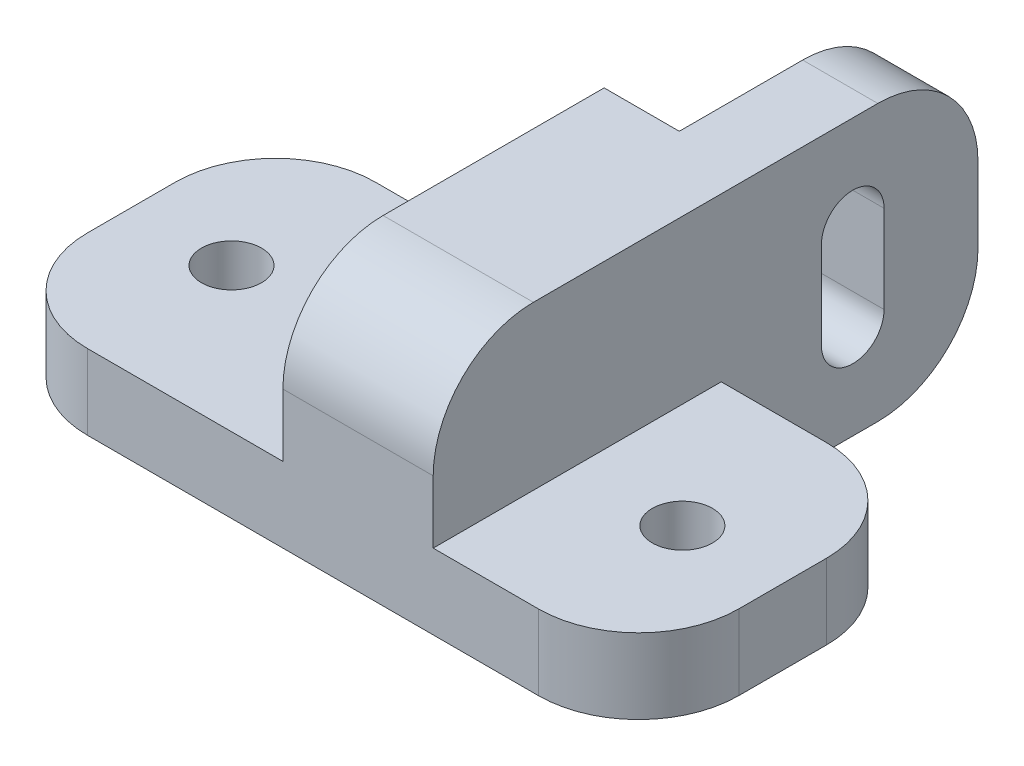
ISO-10303-21;
HEADER;
FILE_DESCRIPTION(('STEP AP214'),'2;1');
FILE_NAME('part.step','',(''),(''),'','','');
FILE_SCHEMA(('AUTOMOTIVE_DESIGN { 1 0 10303 214 1 1 1 1 }'));
ENDSEC;
DATA;
#1=APPLICATION_CONTEXT('core data for automotive mechanical design processes');
#2=APPLICATION_PROTOCOL_DEFINITION('international standard','automotive_design',2000,#1);
#3=PRODUCT_CONTEXT('',#1,'mechanical');
#4=PRODUCT('Part','Part','',(#3));
#5=PRODUCT_RELATED_PRODUCT_CATEGORY('part','',(#4));
#6=PRODUCT_DEFINITION_FORMATION('','',#4);
#7=PRODUCT_DEFINITION_CONTEXT('part definition',#1,'design');
#8=PRODUCT_DEFINITION('design','',#6,#7);
#9=PRODUCT_DEFINITION_SHAPE('','',#8);
#10=(LENGTH_UNIT() NAMED_UNIT(*) SI_UNIT(.MILLI.,.METRE.));
#11=(NAMED_UNIT(*) PLANE_ANGLE_UNIT() SI_UNIT($,.RADIAN.));
#12=(NAMED_UNIT(*) SI_UNIT($,.STERADIAN.) SOLID_ANGLE_UNIT());
#13=UNCERTAINTY_MEASURE_WITH_UNIT(LENGTH_MEASURE(1.E-05),#10,'distance_accuracy_value','');
#14=(GEOMETRIC_REPRESENTATION_CONTEXT(3) GLOBAL_UNCERTAINTY_ASSIGNED_CONTEXT((#13)) GLOBAL_UNIT_ASSIGNED_CONTEXT((#10,
#11,#12)) REPRESENTATION_CONTEXT('',''));
#15=CARTESIAN_POINT('',(0.,0.,0.));
#16=DIRECTION('',(0.,0.,1.));
#17=DIRECTION('',(1.,0.,0.));
#18=AXIS2_PLACEMENT_3D('',#15,#16,#17);
#19=CARTESIAN_POINT('',(1.8,0.,0.));
#20=DIRECTION('',(1.,0.,0.));
#21=DIRECTION('',(0.,0.,-1.));
#22=AXIS2_PLACEMENT_3D('',#19,#20,#21);
#23=PLANE('',#22);
#24=DIRECTION('',(0.,-1.,0.));
#25=VECTOR('',#24,1.);
#26=CARTESIAN_POINT('',(1.8,0.,-9.75));
#27=LINE('',#26,#25);
#28=CARTESIAN_POINT('',(1.8,5.75,-9.75));
#29=VERTEX_POINT('',#28);
#30=CARTESIAN_POINT('',(1.8,2.25,-9.75));
#31=VERTEX_POINT('',#30);
#32=EDGE_CURVE('E233',#29,#31,#27,.T.);
#33=ORIENTED_EDGE('',*,*,#32,.T.);
#34=CARTESIAN_POINT('',(1.8,2.25,-11.));
#35=DIRECTION('',(1.,0.,0.));
#36=DIRECTION('',(0.,0.,-1.));
#37=AXIS2_PLACEMENT_3D('',#34,#35,#36);
#38=CIRCLE('',#37,1.25);
#39=CARTESIAN_POINT('',(1.8,2.25,-12.25));
#40=VERTEX_POINT('',#39);
#41=EDGE_CURVE('E236',#31,#40,#38,.T.);
#42=ORIENTED_EDGE('',*,*,#41,.T.);
#43=DIRECTION('',(0.,1.,0.));
#44=VECTOR('',#43,1.);
#45=CARTESIAN_POINT('',(1.8,0.,-12.25));
#46=LINE('',#45,#44);
#47=CARTESIAN_POINT('',(1.8,5.75,-12.25));
#48=VERTEX_POINT('',#47);
#49=EDGE_CURVE('E228',#40,#48,#46,.T.);
#50=ORIENTED_EDGE('',*,*,#49,.T.);
#51=CARTESIAN_POINT('',(1.8,5.75,-11.));
#52=DIRECTION('',(1.,0.,0.));
#53=DIRECTION('',(0.,0.,-1.));
#54=AXIS2_PLACEMENT_3D('',#51,#52,#53);
#55=CIRCLE('',#54,1.25);
#56=EDGE_CURVE('E204',#48,#29,#55,.T.);
#57=ORIENTED_EDGE('',*,*,#56,.T.);
#58=EDGE_LOOP('',(#33,#42,#50,#57));
#59=FACE_BOUND('',#58,.T.);
#60=DIRECTION('',(0.,1.,0.));
#61=VECTOR('',#60,1.);
#62=CARTESIAN_POINT('',(1.8,3.,-16.));
#63=LINE('',#62,#61);
#64=CARTESIAN_POINT('',(1.8,2.5,-16.));
#65=VERTEX_POINT('',#64);
#66=CARTESIAN_POINT('',(1.8,5.5,-16.));
#67=VERTEX_POINT('',#66);
#68=EDGE_CURVE('E287',#65,#67,#63,.T.);
#69=ORIENTED_EDGE('',*,*,#68,.F.);
#70=CARTESIAN_POINT('',(1.8,2.5,-12.));
#71=DIRECTION('',(1.,0.,0.));
#72=DIRECTION('',(0.,0.,-1.));
#73=AXIS2_PLACEMENT_3D('',#70,#71,#72);
#74=CIRCLE('',#73,4.);
#75=CARTESIAN_POINT('',(1.8,-1.5,-12.));
#76=VERTEX_POINT('',#75);
#77=EDGE_CURVE('E372',#65,#76,#74,.F.);
#78=ORIENTED_EDGE('',*,*,#77,.T.);
#79=DIRECTION('',(0.,0.,-1.));
#80=VECTOR('',#79,1.);
#81=CARTESIAN_POINT('',(1.8,-1.5,-5.75));
#82=LINE('',#81,#80);
#83=CARTESIAN_POINT('',(1.8,-1.5,-7.07500000000134));
#84=VERTEX_POINT('',#83);
#85=EDGE_CURVE('E268',#84,#76,#82,.T.);
#86=ORIENTED_EDGE('',*,*,#85,.F.);
#87=DIRECTION('',(0.,-1.,0.));
#88=VECTOR('',#87,1.);
#89=CARTESIAN_POINT('',(1.8,9.5,-7.07500000000134));
#90=LINE('',#89,#88);
#91=CARTESIAN_POINT('',(1.8,9.5,-7.07500000000134));
#92=VERTEX_POINT('',#91);
#93=EDGE_CURVE('E239',#92,#84,#90,.T.);
#94=ORIENTED_EDGE('',*,*,#93,.F.);
#95=DIRECTION('',(0.,0.,1.));
#96=VECTOR('',#95,1.);
#97=CARTESIAN_POINT('',(1.8,9.5,0.));
#98=LINE('',#97,#96);
#99=CARTESIAN_POINT('',(1.8,9.5,-12.));
#100=VERTEX_POINT('',#99);
#101=EDGE_CURVE('E273',#100,#92,#98,.T.);
#102=ORIENTED_EDGE('',*,*,#101,.F.);
#103=CARTESIAN_POINT('',(1.8,5.5,-12.));
#104=DIRECTION('',(1.,0.,0.));
#105=DIRECTION('',(0.,0.,-1.));
#106=AXIS2_PLACEMENT_3D('',#103,#104,#105);
#107=CIRCLE('',#106,4.);
#108=EDGE_CURVE('E370',#100,#67,#107,.F.);
#109=ORIENTED_EDGE('',*,*,#108,.T.);
#110=EDGE_LOOP('',(#69,#78,#86,#94,#102,#109));
#111=FACE_BOUND('',#110,.T.);
#112=ADVANCED_FACE('F32',(#59,#111),#23,.F.);
#113=CARTESIAN_POINT('',(-13.,3.,-5.75));
#114=DIRECTION('',(0.,0.,1.));
#115=DIRECTION('',(1.,0.,0.));
#116=AXIS2_PLACEMENT_3D('',#113,#114,#115);
#117=PLANE('',#116);
#118=DIRECTION('',(-1.,0.,0.));
#119=VECTOR('',#118,1.);
#120=CARTESIAN_POINT('',(-13.,3.,-5.75));
#121=LINE('',#120,#119);
#122=CARTESIAN_POINT('',(-1.2,3.,-5.75));
#123=VERTEX_POINT('',#122);
#124=CARTESIAN_POINT('',(-9.,3.,-5.75));
#125=VERTEX_POINT('',#124);
#126=EDGE_CURVE('E296',#123,#125,#121,.T.);
#127=ORIENTED_EDGE('',*,*,#126,.F.);
#128=DIRECTION('',(0.,1.,0.));
#129=VECTOR('',#128,1.);
#130=CARTESIAN_POINT('',(-1.2,-1.5,-5.75));
#131=LINE('',#130,#129);
#132=CARTESIAN_POINT('',(-1.2,0.,-5.75));
#133=VERTEX_POINT('',#132);
#134=EDGE_CURVE('E256',#133,#123,#131,.T.);
#135=ORIENTED_EDGE('',*,*,#134,.F.);
#136=DIRECTION('',(-1.,0.,0.));
#137=VECTOR('',#136,1.);
#138=CARTESIAN_POINT('',(-13.,0.,-5.75));
#139=LINE('',#138,#137);
#140=CARTESIAN_POINT('',(-9.,0.,-5.75));
#141=VERTEX_POINT('',#140);
#142=EDGE_CURVE('E310',#133,#141,#139,.T.);
#143=ORIENTED_EDGE('',*,*,#142,.T.);
#144=DIRECTION('',(0.,-1.,0.));
#145=VECTOR('',#144,1.);
#146=CARTESIAN_POINT('',(-8.99999999999999,3.,-5.75));
#147=LINE('',#146,#145);
#148=EDGE_CURVE('E350',#141,#125,#147,.F.);
#149=ORIENTED_EDGE('',*,*,#148,.T.);
#150=EDGE_LOOP('',(#127,#135,#143,#149));
#151=FACE_BOUND('',#150,.T.);
#152=ADVANCED_FACE('F409',(#151),#117,.F.);
#153=CARTESIAN_POINT('',(0.,3.,0.));
#154=DIRECTION('',(0.,-1.,0.));
#155=DIRECTION('',(0.,0.,-1.));
#156=AXIS2_PLACEMENT_3D('',#153,#154,#155);
#157=PLANE('',#156);
#158=CARTESIAN_POINT('',(-9.000145119,3.,0.001069025));
#159=DIRECTION('',(0.,-1.,0.));
#160=DIRECTION('',(0.,0.,-1.));
#161=AXIS2_PLACEMENT_3D('',#158,#159,#160);
#162=CIRCLE('',#161,1.2);
#163=CARTESIAN_POINT('',(-9.000145119,3.,-1.198930975));
#164=VERTEX_POINT('',#163);
#165=EDGE_CURVE('E518',#164,#164,#162,.T.);
#166=ORIENTED_EDGE('',*,*,#165,.T.);
#167=EDGE_LOOP('',(#166));
#168=FACE_BOUND('',#167,.T.);
#169=DIRECTION('',(1.,0.,0.));
#170=VECTOR('',#169,1.);
#171=CARTESIAN_POINT('',(-13.,3.,5.75));
#172=LINE('',#171,#170);
#173=CARTESIAN_POINT('',(-9.,3.,5.75));
#174=VERTEX_POINT('',#173);
#175=CARTESIAN_POINT('',(-1.2,3.,5.75));
#176=VERTEX_POINT('',#175);
#177=EDGE_CURVE('E305',#174,#176,#172,.T.);
#178=ORIENTED_EDGE('',*,*,#177,.T.);
#179=DIRECTION('',(0.,0.,1.));
#180=VECTOR('',#179,1.);
#181=CARTESIAN_POINT('',(-1.2,3.,-5.75));
#182=LINE('',#181,#180);
#183=EDGE_CURVE('E240',#123,#176,#182,.T.);
#184=ORIENTED_EDGE('',*,*,#183,.F.);
#185=ORIENTED_EDGE('',*,*,#126,.T.);
#186=CARTESIAN_POINT('',(-8.99999999999999,3.,-1.75));
#187=DIRECTION('',(0.,-1.,0.));
#188=DIRECTION('',(0.,0.,-1.));
#189=AXIS2_PLACEMENT_3D('',#186,#187,#188);
#190=CIRCLE('',#189,4.);
#191=CARTESIAN_POINT('',(-13.,3.,-1.75));
#192=VERTEX_POINT('',#191);
#193=EDGE_CURVE('E343',#125,#192,#190,.F.);
#194=ORIENTED_EDGE('',*,*,#193,.T.);
#195=DIRECTION('',(0.,0.,1.));
#196=VECTOR('',#195,1.);
#197=CARTESIAN_POINT('',(-13.,3.,5.75));
#198=LINE('',#197,#196);
#199=CARTESIAN_POINT('',(-13.,3.,1.75));
#200=VERTEX_POINT('',#199);
#201=EDGE_CURVE('E301',#192,#200,#198,.T.);
#202=ORIENTED_EDGE('',*,*,#201,.T.);
#203=CARTESIAN_POINT('',(-8.99999999999999,3.,1.75));
#204=DIRECTION('',(0.,-1.,0.));
#205=DIRECTION('',(0.,0.,-1.));
#206=AXIS2_PLACEMENT_3D('',#203,#204,#205);
#207=CIRCLE('',#206,4.);
#208=EDGE_CURVE('E345',#200,#174,#207,.F.);
#209=ORIENTED_EDGE('',*,*,#208,.T.);
#210=EDGE_LOOP('',(#178,#184,#185,#194,#202,#209));
#211=FACE_BOUND('',#210,.T.);
#212=ADVANCED_FACE('F415',(#168,#211),#157,.F.);
#213=CARTESIAN_POINT('',(13.,3.,5.75));
#214=DIRECTION('',(-1.,0.,0.));
#215=DIRECTION('',(0.,0.,1.));
#216=AXIS2_PLACEMENT_3D('',#213,#214,#215);
#217=PLANE('',#216);
#218=DIRECTION('',(0.,0.,-1.));
#219=VECTOR('',#218,1.);
#220=CARTESIAN_POINT('',(13.,0.,5.75));
#221=LINE('',#220,#219);
#222=CARTESIAN_POINT('',(13.,0.,1.75));
#223=VERTEX_POINT('',#222);
#224=CARTESIAN_POINT('',(13.,0.,-1.75));
#225=VERTEX_POINT('',#224);
#226=EDGE_CURVE('E292',#223,#225,#221,.T.);
#227=ORIENTED_EDGE('',*,*,#226,.T.);
#228=DIRECTION('',(0.,-1.,0.));
#229=VECTOR('',#228,1.);
#230=CARTESIAN_POINT('',(13.,3.,-1.75));
#231=LINE('',#230,#229);
#232=CARTESIAN_POINT('',(13.,3.,-1.75));
#233=VERTEX_POINT('',#232);
#234=EDGE_CURVE('E356',#225,#233,#231,.F.);
#235=ORIENTED_EDGE('',*,*,#234,.T.);
#236=DIRECTION('',(0.,0.,-1.));
#237=VECTOR('',#236,1.);
#238=CARTESIAN_POINT('',(13.,3.,5.75));
#239=LINE('',#238,#237);
#240=CARTESIAN_POINT('',(13.,3.,1.75));
#241=VERTEX_POINT('',#240);
#242=EDGE_CURVE('E293',#241,#233,#239,.T.);
#243=ORIENTED_EDGE('',*,*,#242,.F.);
#244=DIRECTION('',(0.,-1.,0.));
#245=VECTOR('',#244,1.);
#246=CARTESIAN_POINT('',(13.,3.,1.75));
#247=LINE('',#246,#245);
#248=EDGE_CURVE('E353',#241,#223,#247,.T.);
#249=ORIENTED_EDGE('',*,*,#248,.T.);
#250=EDGE_LOOP('',(#227,#235,#243,#249));
#251=FACE_BOUND('',#250,.T.);
#252=ADVANCED_FACE('F451',(#251),#217,.F.);
#253=CARTESIAN_POINT('',(9.,0.,-5.75));
#254=VERTEX_POINT('',#253);
#255=CARTESIAN_POINT('',(4.8,0.,-5.75));
#256=VERTEX_POINT('',#255);
#257=EDGE_CURVE('E311',#254,#256,#139,.T.);
#258=ORIENTED_EDGE('',*,*,#257,.T.);
#259=DIRECTION('',(0.,-1.,0.));
#260=VECTOR('',#259,1.);
#261=CARTESIAN_POINT('',(4.80000000000001,-1.5,-5.75));
#262=LINE('',#261,#260);
#263=CARTESIAN_POINT('',(4.8,3.,-5.75));
#264=VERTEX_POINT('',#263);
#265=EDGE_CURVE('E274',#264,#256,#262,.T.);
#266=ORIENTED_EDGE('',*,*,#265,.F.);
#267=CARTESIAN_POINT('',(9.,3.,-5.75));
#268=VERTEX_POINT('',#267);
#269=EDGE_CURVE('E298',#268,#264,#121,.T.);
#270=ORIENTED_EDGE('',*,*,#269,.F.);
#271=DIRECTION('',(0.,-1.,0.));
#272=VECTOR('',#271,1.);
#273=CARTESIAN_POINT('',(9.00000000000001,3.,-5.75));
#274=LINE('',#273,#272);
#275=EDGE_CURVE('E347',#268,#254,#274,.T.);
#276=ORIENTED_EDGE('',*,*,#275,.T.);
#277=EDGE_LOOP('',(#258,#266,#270,#276));
#278=FACE_BOUND('',#277,.T.);
#279=ADVANCED_FACE('F418',(#278),#117,.F.);
#280=CARTESIAN_POINT('',(-13.,3.,5.75));
#281=DIRECTION('',(1.,0.,0.));
#282=DIRECTION('',(0.,0.,-1.));
#283=AXIS2_PLACEMENT_3D('',#280,#281,#282);
#284=PLANE('',#283);
#285=DIRECTION('',(0.,0.,1.));
#286=VECTOR('',#285,1.);
#287=CARTESIAN_POINT('',(-13.,0.,5.75));
#288=LINE('',#287,#286);
#289=CARTESIAN_POINT('',(-13.,0.,-1.75));
#290=VERTEX_POINT('',#289);
#291=CARTESIAN_POINT('',(-13.,0.,1.75));
#292=VERTEX_POINT('',#291);
#293=EDGE_CURVE('E314',#290,#292,#288,.T.);
#294=ORIENTED_EDGE('',*,*,#293,.T.);
#295=DIRECTION('',(0.,-1.,0.));
#296=VECTOR('',#295,1.);
#297=CARTESIAN_POINT('',(-13.,3.,1.75));
#298=LINE('',#297,#296);
#299=EDGE_CURVE('E337',#292,#200,#298,.F.);
#300=ORIENTED_EDGE('',*,*,#299,.T.);
#301=ORIENTED_EDGE('',*,*,#201,.F.);
#302=DIRECTION('',(0.,-1.,0.));
#303=VECTOR('',#302,1.);
#304=CARTESIAN_POINT('',(-13.,3.,-1.75));
#305=LINE('',#304,#303);
#306=EDGE_CURVE('E334',#192,#290,#305,.T.);
#307=ORIENTED_EDGE('',*,*,#306,.T.);
#308=EDGE_LOOP('',(#294,#300,#301,#307));
#309=FACE_BOUND('',#308,.T.);
#310=ADVANCED_FACE('F445',(#309),#284,.F.);
#311=CARTESIAN_POINT('',(-13.,3.,5.75));
#312=DIRECTION('',(0.,0.,-1.));
#313=DIRECTION('',(-1.,0.,0.));
#314=AXIS2_PLACEMENT_3D('',#311,#312,#313);
#315=PLANE('',#314);
#316=DIRECTION('',(0.,-1.,0.));
#317=VECTOR('',#316,1.);
#318=CARTESIAN_POINT('',(4.80000000000001,3.,5.75));
#319=LINE('',#318,#317);
#320=CARTESIAN_POINT('',(4.80000000000001,5.5,5.75));
#321=VERTEX_POINT('',#320);
#322=CARTESIAN_POINT('',(4.8,3.,5.75));
#323=VERTEX_POINT('',#322);
#324=EDGE_CURVE('E283',#321,#323,#319,.T.);
#325=ORIENTED_EDGE('',*,*,#324,.F.);
#326=DIRECTION('',(-1.,0.,0.));
#327=VECTOR('',#326,1.);
#328=CARTESIAN_POINT('',(-13.,5.5,5.75));
#329=LINE('',#328,#327);
#330=CARTESIAN_POINT('',(-1.2,5.5,5.75));
#331=VERTEX_POINT('',#330);
#332=EDGE_CURVE('E358',#321,#331,#329,.T.);
#333=ORIENTED_EDGE('',*,*,#332,.T.);
#334=DIRECTION('',(0.,1.,0.));
#335=VECTOR('',#334,1.);
#336=CARTESIAN_POINT('',(-1.2,3.,5.75));
#337=LINE('',#336,#335);
#338=EDGE_CURVE('E243',#176,#331,#337,.T.);
#339=ORIENTED_EDGE('',*,*,#338,.F.);
#340=ORIENTED_EDGE('',*,*,#177,.F.);
#341=DIRECTION('',(0.,-1.,0.));
#342=VECTOR('',#341,1.);
#343=CARTESIAN_POINT('',(-8.99999999999999,3.,5.75));
#344=LINE('',#343,#342);
#345=CARTESIAN_POINT('',(-9.,0.,5.75));
#346=VERTEX_POINT('',#345);
#347=EDGE_CURVE('E322',#174,#346,#344,.T.);
#348=ORIENTED_EDGE('',*,*,#347,.T.);
#349=DIRECTION('',(1.,0.,0.));
#350=VECTOR('',#349,1.);
#351=CARTESIAN_POINT('',(-13.,0.,5.75));
#352=LINE('',#351,#350);
#353=CARTESIAN_POINT('',(9.,0.,5.75));
#354=VERTEX_POINT('',#353);
#355=EDGE_CURVE('E297',#346,#354,#352,.T.);
#356=ORIENTED_EDGE('',*,*,#355,.T.);
#357=DIRECTION('',(0.,-1.,0.));
#358=VECTOR('',#357,1.);
#359=CARTESIAN_POINT('',(9.00000000000001,3.,5.75));
#360=LINE('',#359,#358);
#361=CARTESIAN_POINT('',(9.,3.,5.75));
#362=VERTEX_POINT('',#361);
#363=EDGE_CURVE('E307',#354,#362,#360,.F.);
#364=ORIENTED_EDGE('',*,*,#363,.T.);
#365=EDGE_CURVE('E304',#323,#362,#172,.T.);
#366=ORIENTED_EDGE('',*,*,#365,.F.);
#367=EDGE_LOOP('',(#325,#333,#339,#340,#348,#356,#364,#366));
#368=FACE_BOUND('',#367,.T.);
#369=ADVANCED_FACE('F437',(#368),#315,.F.);
#370=CARTESIAN_POINT('',(8.997973452,3.,-0.000616233));
#371=DIRECTION('',(0.,-1.,0.));
#372=DIRECTION('',(0.,0.,-1.));
#373=AXIS2_PLACEMENT_3D('',#370,#371,#372);
#374=CIRCLE('',#373,1.2);
#375=CARTESIAN_POINT('',(8.997973452,3.,-1.200616233));
#376=VERTEX_POINT('',#375);
#377=EDGE_CURVE('E524',#376,#376,#374,.T.);
#378=ORIENTED_EDGE('',*,*,#377,.T.);
#379=EDGE_LOOP('',(#378));
#380=FACE_BOUND('',#379,.T.);
#381=ORIENTED_EDGE('',*,*,#269,.T.);
#382=DIRECTION('',(0.,0.,-1.));
#383=VECTOR('',#382,1.);
#384=CARTESIAN_POINT('',(4.80000000000001,3.,5.75));
#385=LINE('',#384,#383);
#386=EDGE_CURVE('E269',#323,#264,#385,.T.);
#387=ORIENTED_EDGE('',*,*,#386,.F.);
#388=ORIENTED_EDGE('',*,*,#365,.T.);
#389=CARTESIAN_POINT('',(9.00000000000001,3.,1.75));
#390=DIRECTION('',(0.,-1.,0.));
#391=DIRECTION('',(0.,0.,-1.));
#392=AXIS2_PLACEMENT_3D('',#389,#390,#391);
#393=CIRCLE('',#392,4.);
#394=EDGE_CURVE('E339',#362,#241,#393,.F.);
#395=ORIENTED_EDGE('',*,*,#394,.T.);
#396=ORIENTED_EDGE('',*,*,#242,.T.);
#397=CARTESIAN_POINT('',(9.00000000000001,3.,-1.75));
#398=DIRECTION('',(0.,-1.,0.));
#399=DIRECTION('',(0.,0.,-1.));
#400=AXIS2_PLACEMENT_3D('',#397,#398,#399);
#401=CIRCLE('',#400,4.);
#402=EDGE_CURVE('E341',#233,#268,#401,.F.);
#403=ORIENTED_EDGE('',*,*,#402,.T.);
#404=EDGE_LOOP('',(#381,#387,#388,#395,#396,#403));
#405=FACE_BOUND('',#404,.T.);
#406=ADVANCED_FACE('F433',(#380,#405),#157,.F.);
#407=CARTESIAN_POINT('',(0.,0.,0.));
#408=DIRECTION('',(0.,-1.,0.));
#409=DIRECTION('',(0.,0.,-1.));
#410=AXIS2_PLACEMENT_3D('',#407,#408,#409);
#411=PLANE('',#410);
#412=CARTESIAN_POINT('',(-9.000145119,0.,0.001069025));
#413=DIRECTION('',(0.,-1.,0.));
#414=DIRECTION('',(0.,0.,-1.));
#415=AXIS2_PLACEMENT_3D('',#412,#413,#414);
#416=CIRCLE('',#415,1.2);
#417=CARTESIAN_POINT('',(-9.000145119,0.,-1.198930975));
#418=VERTEX_POINT('',#417);
#419=EDGE_CURVE('E521',#418,#418,#416,.T.);
#420=ORIENTED_EDGE('',*,*,#419,.F.);
#421=EDGE_LOOP('',(#420));
#422=FACE_BOUND('',#421,.T.);
#423=CARTESIAN_POINT('',(8.997973452,0.,-0.000616233));
#424=DIRECTION('',(0.,-1.,0.));
#425=DIRECTION('',(0.,0.,-1.));
#426=AXIS2_PLACEMENT_3D('',#423,#424,#425);
#427=CIRCLE('',#426,1.2);
#428=CARTESIAN_POINT('',(8.997973452,0.,-1.200616233));
#429=VERTEX_POINT('',#428);
#430=EDGE_CURVE('E520',#429,#429,#427,.T.);
#431=ORIENTED_EDGE('',*,*,#430,.F.);
#432=EDGE_LOOP('',(#431));
#433=FACE_BOUND('',#432,.T.);
#434=ORIENTED_EDGE('',*,*,#355,.F.);
#435=CARTESIAN_POINT('',(-8.99999999999999,0.,1.75));
#436=DIRECTION('',(0.,-1.,0.));
#437=DIRECTION('',(0.,0.,-1.));
#438=AXIS2_PLACEMENT_3D('',#435,#436,#437);
#439=CIRCLE('',#438,4.);
#440=EDGE_CURVE('E332',#346,#292,#439,.T.);
#441=ORIENTED_EDGE('',*,*,#440,.T.);
#442=ORIENTED_EDGE('',*,*,#293,.F.);
#443=CARTESIAN_POINT('',(-8.99999999999999,0.,-1.75));
#444=DIRECTION('',(0.,-1.,0.));
#445=DIRECTION('',(0.,0.,-1.));
#446=AXIS2_PLACEMENT_3D('',#443,#444,#445);
#447=CIRCLE('',#446,4.);
#448=EDGE_CURVE('E329',#290,#141,#447,.T.);
#449=ORIENTED_EDGE('',*,*,#448,.T.);
#450=ORIENTED_EDGE('',*,*,#142,.F.);
#451=EDGE_CURVE('E315',#256,#133,#139,.T.);
#452=ORIENTED_EDGE('',*,*,#451,.F.);
#453=ORIENTED_EDGE('',*,*,#257,.F.);
#454=CARTESIAN_POINT('',(9.00000000000001,0.,-1.75));
#455=DIRECTION('',(0.,-1.,0.));
#456=DIRECTION('',(0.,0.,-1.));
#457=AXIS2_PLACEMENT_3D('',#454,#455,#456);
#458=CIRCLE('',#457,4.);
#459=EDGE_CURVE('E327',#254,#225,#458,.T.);
#460=ORIENTED_EDGE('',*,*,#459,.T.);
#461=ORIENTED_EDGE('',*,*,#226,.F.);
#462=CARTESIAN_POINT('',(9.00000000000001,0.,1.75));
#463=DIRECTION('',(0.,-1.,0.));
#464=DIRECTION('',(0.,0.,-1.));
#465=AXIS2_PLACEMENT_3D('',#462,#463,#464);
#466=CIRCLE('',#465,4.);
#467=EDGE_CURVE('E325',#223,#354,#466,.T.);
#468=ORIENTED_EDGE('',*,*,#467,.T.);
#469=EDGE_LOOP('',(#434,#441,#442,#449,#450,#452,#453,#460,#461,#468));
#470=FACE_BOUND('',#469,.T.);
#471=ADVANCED_FACE('F436',(#422,#433,#470),#411,.T.);
#472=CARTESIAN_POINT('',(-8.99999999999999,3.,1.75));
#473=DIRECTION('',(0.,-1.,0.));
#474=DIRECTION('',(0.,0.,-1.));
#475=AXIS2_PLACEMENT_3D('',#472,#473,#474);
#476=CYLINDRICAL_SURFACE('',#475,4.);
#477=ORIENTED_EDGE('',*,*,#208,.F.);
#478=ORIENTED_EDGE('',*,*,#299,.F.);
#479=ORIENTED_EDGE('',*,*,#440,.F.);
#480=ORIENTED_EDGE('',*,*,#347,.F.);
#481=EDGE_LOOP('',(#477,#478,#479,#480));
#482=FACE_BOUND('',#481,.T.);
#483=ADVANCED_FACE('F441',(#482),#476,.T.);
#484=CARTESIAN_POINT('',(-8.99999999999999,3.,-1.75));
#485=DIRECTION('',(0.,-1.,0.));
#486=DIRECTION('',(0.,0.,-1.));
#487=AXIS2_PLACEMENT_3D('',#484,#485,#486);
#488=CYLINDRICAL_SURFACE('',#487,4.);
#489=ORIENTED_EDGE('',*,*,#193,.F.);
#490=ORIENTED_EDGE('',*,*,#148,.F.);
#491=ORIENTED_EDGE('',*,*,#448,.F.);
#492=ORIENTED_EDGE('',*,*,#306,.F.);
#493=EDGE_LOOP('',(#489,#490,#491,#492));
#494=FACE_BOUND('',#493,.T.);
#495=ADVANCED_FACE('F458',(#494),#488,.T.);
#496=CARTESIAN_POINT('',(9.00000000000001,3.,-1.75));
#497=DIRECTION('',(0.,-1.,0.));
#498=DIRECTION('',(0.,0.,-1.));
#499=AXIS2_PLACEMENT_3D('',#496,#497,#498);
#500=CYLINDRICAL_SURFACE('',#499,4.);
#501=ORIENTED_EDGE('',*,*,#402,.F.);
#502=ORIENTED_EDGE('',*,*,#234,.F.);
#503=ORIENTED_EDGE('',*,*,#459,.F.);
#504=ORIENTED_EDGE('',*,*,#275,.F.);
#505=EDGE_LOOP('',(#501,#502,#503,#504));
#506=FACE_BOUND('',#505,.T.);
#507=ADVANCED_FACE('F462',(#506),#500,.T.);
#508=CARTESIAN_POINT('',(9.00000000000001,3.,1.75));
#509=DIRECTION('',(0.,-1.,0.));
#510=DIRECTION('',(0.,0.,-1.));
#511=AXIS2_PLACEMENT_3D('',#508,#509,#510);
#512=CYLINDRICAL_SURFACE('',#511,4.);
#513=ORIENTED_EDGE('',*,*,#394,.F.);
#514=ORIENTED_EDGE('',*,*,#363,.F.);
#515=ORIENTED_EDGE('',*,*,#467,.F.);
#516=ORIENTED_EDGE('',*,*,#248,.F.);
#517=EDGE_LOOP('',(#513,#514,#515,#516));
#518=FACE_BOUND('',#517,.T.);
#519=ADVANCED_FACE('F431',(#518),#512,.T.);
#520=CARTESIAN_POINT('',(4.80000000000001,-1.5,-5.75));
#521=DIRECTION('',(0.,0.,-1.));
#522=DIRECTION('',(0.,1.,0.));
#523=AXIS2_PLACEMENT_3D('',#520,#521,#522);
#524=PLANE('',#523);
#525=ORIENTED_EDGE('',*,*,#451,.T.);
#526=CARTESIAN_POINT('',(-1.2,-1.5,-5.75));
#527=VERTEX_POINT('',#526);
#528=EDGE_CURVE('E257',#527,#133,#131,.T.);
#529=ORIENTED_EDGE('',*,*,#528,.F.);
#530=DIRECTION('',(-1.,0.,0.));
#531=VECTOR('',#530,1.);
#532=CARTESIAN_POINT('',(4.80000000000001,-1.5,-5.75));
#533=LINE('',#532,#531);
#534=CARTESIAN_POINT('',(4.80000000000001,-1.5,-5.75));
#535=VERTEX_POINT('',#534);
#536=EDGE_CURVE('E285',#535,#527,#533,.T.);
#537=ORIENTED_EDGE('',*,*,#536,.F.);
#538=EDGE_CURVE('E272',#256,#535,#262,.T.);
#539=ORIENTED_EDGE('',*,*,#538,.F.);
#540=EDGE_LOOP('',(#525,#529,#537,#539));
#541=FACE_BOUND('',#540,.T.);
#542=ADVANCED_FACE('F428',(#541),#524,.F.);
#543=CARTESIAN_POINT('',(4.80000000000001,-1.5,-5.75));
#544=DIRECTION('',(0.,1.,0.));
#545=DIRECTION('',(0.,0.,1.));
#546=AXIS2_PLACEMENT_3D('',#543,#544,#545);
#547=PLANE('',#546);
#548=ORIENTED_EDGE('',*,*,#85,.T.);
#549=DIRECTION('',(-1.,0.,0.));
#550=VECTOR('',#549,1.);
#551=CARTESIAN_POINT('',(4.80000000000001,-1.5,-12.));
#552=LINE('',#551,#550);
#553=CARTESIAN_POINT('',(4.80000000000001,-1.5,-12.));
#554=VERTEX_POINT('',#553);
#555=EDGE_CURVE('E55',#76,#554,#552,.F.);
#556=ORIENTED_EDGE('',*,*,#555,.T.);
#557=DIRECTION('',(0.,0.,-1.));
#558=VECTOR('',#557,1.);
#559=CARTESIAN_POINT('',(4.80000000000001,-1.5,-5.75));
#560=LINE('',#559,#558);
#561=EDGE_CURVE('E277',#535,#554,#560,.T.);
#562=ORIENTED_EDGE('',*,*,#561,.F.);
#563=ORIENTED_EDGE('',*,*,#536,.T.);
#564=DIRECTION('',(0.,0.,1.));
#565=VECTOR('',#564,1.);
#566=CARTESIAN_POINT('',(-1.2,-1.5,-7.07500000000134));
#567=LINE('',#566,#565);
#568=CARTESIAN_POINT('',(-1.2,-1.5,-7.07500000000134));
#569=VERTEX_POINT('',#568);
#570=EDGE_CURVE('E253',#569,#527,#567,.T.);
#571=ORIENTED_EDGE('',*,*,#570,.F.);
#572=DIRECTION('',(1.,0.,0.));
#573=VECTOR('',#572,1.);
#574=CARTESIAN_POINT('',(-1.2,-1.5,-7.07500000000134));
#575=LINE('',#574,#573);
#576=EDGE_CURVE('E260',#569,#84,#575,.T.);
#577=ORIENTED_EDGE('',*,*,#576,.T.);
#578=EDGE_LOOP('',(#548,#556,#562,#563,#571,#577));
#579=FACE_BOUND('',#578,.T.);
#580=ADVANCED_FACE('F386',(#579),#547,.F.);
#581=CARTESIAN_POINT('',(4.80000000000001,3.,-16.));
#582=DIRECTION('',(0.,0.,1.));
#583=DIRECTION('',(1.,0.,0.));
#584=AXIS2_PLACEMENT_3D('',#581,#582,#583);
#585=PLANE('',#584);
#586=DIRECTION('',(0.,1.,0.));
#587=VECTOR('',#586,1.);
#588=CARTESIAN_POINT('',(4.80000000000001,3.,-16.));
#589=LINE('',#588,#587);
#590=CARTESIAN_POINT('',(4.80000000000001,2.5,-16.));
#591=VERTEX_POINT('',#590);
#592=CARTESIAN_POINT('',(4.80000000000001,5.5,-16.));
#593=VERTEX_POINT('',#592);
#594=EDGE_CURVE('E279',#591,#593,#589,.T.);
#595=ORIENTED_EDGE('',*,*,#594,.F.);
#596=DIRECTION('',(-1.,0.,0.));
#597=VECTOR('',#596,1.);
#598=CARTESIAN_POINT('',(4.80000000000001,2.5,-16.));
#599=LINE('',#598,#597);
#600=EDGE_CURVE('E367',#591,#65,#599,.T.);
#601=ORIENTED_EDGE('',*,*,#600,.T.);
#602=ORIENTED_EDGE('',*,*,#68,.T.);
#603=DIRECTION('',(-1.,0.,0.));
#604=VECTOR('',#603,1.);
#605=CARTESIAN_POINT('',(4.80000000000001,5.5,-16.));
#606=LINE('',#605,#604);
#607=EDGE_CURVE('E365',#67,#593,#606,.F.);
#608=ORIENTED_EDGE('',*,*,#607,.T.);
#609=EDGE_LOOP('',(#595,#601,#602,#608));
#610=FACE_BOUND('',#609,.T.);
#611=ADVANCED_FACE('F380',(#610),#585,.F.);
#612=CARTESIAN_POINT('',(4.80000000000001,9.5,0.));
#613=DIRECTION('',(0.,-1.,0.));
#614=DIRECTION('',(0.,0.,-1.));
#615=AXIS2_PLACEMENT_3D('',#612,#613,#614);
#616=PLANE('',#615);
#617=DIRECTION('',(0.,0.,1.));
#618=VECTOR('',#617,1.);
#619=CARTESIAN_POINT('',(4.80000000000001,9.5,0.));
#620=LINE('',#619,#618);
#621=CARTESIAN_POINT('',(4.80000000000001,9.5,-12.));
#622=VERTEX_POINT('',#621);
#623=CARTESIAN_POINT('',(4.80000000000001,9.5,1.75));
#624=VERTEX_POINT('',#623);
#625=EDGE_CURVE('E281',#622,#624,#620,.T.);
#626=ORIENTED_EDGE('',*,*,#625,.F.);
#627=DIRECTION('',(-1.,0.,0.));
#628=VECTOR('',#627,1.);
#629=CARTESIAN_POINT('',(4.80000000000001,9.5,-12.));
#630=LINE('',#629,#628);
#631=EDGE_CURVE('E11',#622,#100,#630,.T.);
#632=ORIENTED_EDGE('',*,*,#631,.T.);
#633=ORIENTED_EDGE('',*,*,#101,.T.);
#634=DIRECTION('',(1.,0.,0.));
#635=VECTOR('',#634,1.);
#636=CARTESIAN_POINT('',(-1.2,9.5,-7.07500000000134));
#637=LINE('',#636,#635);
#638=CARTESIAN_POINT('',(-1.2,9.5,-7.07500000000134));
#639=VERTEX_POINT('',#638);
#640=EDGE_CURVE('E265',#639,#92,#637,.T.);
#641=ORIENTED_EDGE('',*,*,#640,.F.);
#642=DIRECTION('',(0.,0.,-1.));
#643=VECTOR('',#642,1.);
#644=CARTESIAN_POINT('',(-1.2,9.5,1.75));
#645=LINE('',#644,#643);
#646=CARTESIAN_POINT('',(-1.2,9.5,1.75));
#647=VERTEX_POINT('',#646);
#648=EDGE_CURVE('E249',#647,#639,#645,.T.);
#649=ORIENTED_EDGE('',*,*,#648,.F.);
#650=DIRECTION('',(-1.,0.,0.));
#651=VECTOR('',#650,1.);
#652=CARTESIAN_POINT('',(4.80000000000001,9.5,1.75));
#653=LINE('',#652,#651);
#654=EDGE_CURVE('E360',#647,#624,#653,.F.);
#655=ORIENTED_EDGE('',*,*,#654,.T.);
#656=EDGE_LOOP('',(#626,#632,#633,#641,#649,#655));
#657=FACE_BOUND('',#656,.T.);
#658=ADVANCED_FACE('F395',(#657),#616,.F.);
#659=CARTESIAN_POINT('',(4.80000000000001,0.,0.));
#660=DIRECTION('',(1.,0.,0.));
#661=DIRECTION('',(0.,0.,-1.));
#662=AXIS2_PLACEMENT_3D('',#659,#660,#661);
#663=PLANE('',#662);
#664=CARTESIAN_POINT('',(4.80000000000001,2.25,-11.));
#665=DIRECTION('',(1.,0.,0.));
#666=DIRECTION('',(0.,0.,-1.));
#667=AXIS2_PLACEMENT_3D('',#664,#665,#666);
#668=CIRCLE('',#667,1.25);
#669=CARTESIAN_POINT('',(4.80000000000001,2.25,-9.75));
#670=VERTEX_POINT('',#669);
#671=CARTESIAN_POINT('',(4.80000000000001,2.25,-12.25));
#672=VERTEX_POINT('',#671);
#673=EDGE_CURVE('E217',#670,#672,#668,.T.);
#674=ORIENTED_EDGE('',*,*,#673,.F.);
#675=DIRECTION('',(0.,-1.,0.));
#676=VECTOR('',#675,1.);
#677=CARTESIAN_POINT('',(4.80000000000001,2.25,-9.75));
#678=LINE('',#677,#676);
#679=CARTESIAN_POINT('',(4.80000000000001,5.75,-9.75));
#680=VERTEX_POINT('',#679);
#681=EDGE_CURVE('E221',#680,#670,#678,.T.);
#682=ORIENTED_EDGE('',*,*,#681,.F.);
#683=CARTESIAN_POINT('',(4.80000000000001,5.75,-11.));
#684=DIRECTION('',(1.,0.,0.));
#685=DIRECTION('',(0.,0.,-1.));
#686=AXIS2_PLACEMENT_3D('',#683,#684,#685);
#687=CIRCLE('',#686,1.25);
#688=CARTESIAN_POINT('',(4.80000000000001,5.75,-12.25));
#689=VERTEX_POINT('',#688);
#690=EDGE_CURVE('E201',#689,#680,#687,.T.);
#691=ORIENTED_EDGE('',*,*,#690,.F.);
#692=DIRECTION('',(0.,1.,0.));
#693=VECTOR('',#692,1.);
#694=CARTESIAN_POINT('',(4.80000000000001,2.25,-12.25));
#695=LINE('',#694,#693);
#696=EDGE_CURVE('E212',#672,#689,#695,.T.);
#697=ORIENTED_EDGE('',*,*,#696,.F.);
#698=EDGE_LOOP('',(#674,#682,#691,#697));
#699=FACE_BOUND('',#698,.T.);
#700=ORIENTED_EDGE('',*,*,#561,.T.);
#701=CARTESIAN_POINT('',(4.80000000000001,2.5,-12.));
#702=DIRECTION('',(1.,0.,0.));
#703=DIRECTION('',(0.,0.,-1.));
#704=AXIS2_PLACEMENT_3D('',#701,#702,#703);
#705=CIRCLE('',#704,4.);
#706=EDGE_CURVE('E40',#554,#591,#705,.T.);
#707=ORIENTED_EDGE('',*,*,#706,.T.);
#708=ORIENTED_EDGE('',*,*,#594,.T.);
#709=CARTESIAN_POINT('',(4.80000000000001,5.5,-12.));
#710=DIRECTION('',(1.,0.,0.));
#711=DIRECTION('',(0.,0.,-1.));
#712=AXIS2_PLACEMENT_3D('',#709,#710,#711);
#713=CIRCLE('',#712,4.);
#714=EDGE_CURVE('E47',#593,#622,#713,.T.);
#715=ORIENTED_EDGE('',*,*,#714,.T.);
#716=ORIENTED_EDGE('',*,*,#625,.T.);
#717=CARTESIAN_POINT('',(4.80000000000001,5.5,1.75));
#718=DIRECTION('',(1.,0.,0.));
#719=DIRECTION('',(0.,0.,-1.));
#720=AXIS2_PLACEMENT_3D('',#717,#718,#719);
#721=CIRCLE('',#720,4.);
#722=EDGE_CURVE('E363',#624,#321,#721,.T.);
#723=ORIENTED_EDGE('',*,*,#722,.T.);
#724=ORIENTED_EDGE('',*,*,#324,.T.);
#725=ORIENTED_EDGE('',*,*,#386,.T.);
#726=ORIENTED_EDGE('',*,*,#265,.T.);
#727=ORIENTED_EDGE('',*,*,#538,.T.);
#728=EDGE_LOOP('',(#700,#707,#708,#715,#716,#723,#724,#725,#726,#727));
#729=FACE_BOUND('',#728,.T.);
#730=ADVANCED_FACE('F219',(#699,#729),#663,.T.);
#731=CARTESIAN_POINT('',(-13.,5.5,1.75));
#732=DIRECTION('',(-1.,0.,0.));
#733=DIRECTION('',(0.,0.,1.));
#734=AXIS2_PLACEMENT_3D('',#731,#732,#733);
#735=CYLINDRICAL_SURFACE('',#734,4.);
#736=ORIENTED_EDGE('',*,*,#722,.F.);
#737=ORIENTED_EDGE('',*,*,#654,.F.);
#738=CARTESIAN_POINT('',(-1.2,5.5,1.75));
#739=DIRECTION('',(-1.,0.,0.));
#740=DIRECTION('',(0.,0.,1.));
#741=AXIS2_PLACEMENT_3D('',#738,#739,#740);
#742=CIRCLE('',#741,4.);
#743=EDGE_CURVE('E246',#331,#647,#742,.T.);
#744=ORIENTED_EDGE('',*,*,#743,.F.);
#745=ORIENTED_EDGE('',*,*,#332,.F.);
#746=EDGE_LOOP('',(#736,#737,#744,#745));
#747=FACE_BOUND('',#746,.T.);
#748=ADVANCED_FACE('F470',(#747),#735,.T.);
#749=CARTESIAN_POINT('',(-1.2,9.5,-7.07500000000134));
#750=DIRECTION('',(0.,0.,1.));
#751=DIRECTION('',(0.,-1.,0.));
#752=AXIS2_PLACEMENT_3D('',#749,#750,#751);
#753=PLANE('',#752);
#754=ORIENTED_EDGE('',*,*,#93,.T.);
#755=ORIENTED_EDGE('',*,*,#576,.F.);
#756=DIRECTION('',(0.,-1.,0.));
#757=VECTOR('',#756,1.);
#758=CARTESIAN_POINT('',(-1.2,9.5,-7.07500000000134));
#759=LINE('',#758,#757);
#760=EDGE_CURVE('E251',#639,#569,#759,.T.);
#761=ORIENTED_EDGE('',*,*,#760,.F.);
#762=ORIENTED_EDGE('',*,*,#640,.T.);
#763=EDGE_LOOP('',(#754,#755,#761,#762));
#764=FACE_BOUND('',#763,.T.);
#765=ADVANCED_FACE('F391',(#764),#753,.F.);
#766=CARTESIAN_POINT('',(-1.2,5.5,1.75));
#767=DIRECTION('',(-1.,0.,0.));
#768=DIRECTION('',(0.,0.,1.));
#769=AXIS2_PLACEMENT_3D('',#766,#767,#768);
#770=PLANE('',#769);
#771=ORIENTED_EDGE('',*,*,#183,.T.);
#772=ORIENTED_EDGE('',*,*,#338,.T.);
#773=ORIENTED_EDGE('',*,*,#743,.T.);
#774=ORIENTED_EDGE('',*,*,#648,.T.);
#775=ORIENTED_EDGE('',*,*,#760,.T.);
#776=ORIENTED_EDGE('',*,*,#570,.T.);
#777=ORIENTED_EDGE('',*,*,#528,.T.);
#778=ORIENTED_EDGE('',*,*,#134,.T.);
#779=EDGE_LOOP('',(#771,#772,#773,#774,#775,#776,#777,#778));
#780=FACE_BOUND('',#779,.T.);
#781=ADVANCED_FACE('F477',(#780),#770,.T.);
#782=CARTESIAN_POINT('',(0.800000000000005,2.25,-11.));
#783=DIRECTION('',(1.,0.,0.));
#784=DIRECTION('',(0.,0.,-1.));
#785=AXIS2_PLACEMENT_3D('',#782,#783,#784);
#786=CYLINDRICAL_SURFACE('',#785,1.25);
#787=DIRECTION('',(1.,0.,0.));
#788=VECTOR('',#787,1.);
#789=CARTESIAN_POINT('',(0.800000000000005,2.25,-9.75));
#790=LINE('',#789,#788);
#791=EDGE_CURVE('E226',#31,#670,#790,.T.);
#792=ORIENTED_EDGE('',*,*,#791,.T.);
#793=ORIENTED_EDGE('',*,*,#673,.T.);
#794=DIRECTION('',(1.,0.,0.));
#795=VECTOR('',#794,1.);
#796=CARTESIAN_POINT('',(0.800000000000005,2.25,-12.25));
#797=LINE('',#796,#795);
#798=EDGE_CURVE('E208',#40,#672,#797,.T.);
#799=ORIENTED_EDGE('',*,*,#798,.F.);
#800=ORIENTED_EDGE('',*,*,#41,.F.);
#801=EDGE_LOOP('',(#792,#793,#799,#800));
#802=FACE_BOUND('',#801,.T.);
#803=ADVANCED_FACE('F531',(#802),#786,.F.);
#804=CARTESIAN_POINT('',(0.800000000000005,2.25,-9.75));
#805=DIRECTION('',(0.,0.,1.));
#806=DIRECTION('',(1.,0.,0.));
#807=AXIS2_PLACEMENT_3D('',#804,#805,#806);
#808=PLANE('',#807);
#809=DIRECTION('',(1.,0.,0.));
#810=VECTOR('',#809,1.);
#811=CARTESIAN_POINT('',(0.800000000000005,5.75,-9.75));
#812=LINE('',#811,#810);
#813=EDGE_CURVE('E207',#29,#680,#812,.T.);
#814=ORIENTED_EDGE('',*,*,#813,.T.);
#815=ORIENTED_EDGE('',*,*,#681,.T.);
#816=ORIENTED_EDGE('',*,*,#791,.F.);
#817=ORIENTED_EDGE('',*,*,#32,.F.);
#818=EDGE_LOOP('',(#814,#815,#816,#817));
#819=FACE_BOUND('',#818,.T.);
#820=ADVANCED_FACE('F534',(#819),#808,.F.);
#821=CARTESIAN_POINT('',(0.800000000000005,5.75,-11.));
#822=DIRECTION('',(1.,0.,0.));
#823=DIRECTION('',(0.,0.,-1.));
#824=AXIS2_PLACEMENT_3D('',#821,#822,#823);
#825=CYLINDRICAL_SURFACE('',#824,1.25);
#826=DIRECTION('',(1.,0.,0.));
#827=VECTOR('',#826,1.);
#828=CARTESIAN_POINT('',(0.800000000000005,5.75,-12.25));
#829=LINE('',#828,#827);
#830=EDGE_CURVE('E196',#48,#689,#829,.T.);
#831=ORIENTED_EDGE('',*,*,#830,.T.);
#832=ORIENTED_EDGE('',*,*,#690,.T.);
#833=ORIENTED_EDGE('',*,*,#813,.F.);
#834=ORIENTED_EDGE('',*,*,#56,.F.);
#835=EDGE_LOOP('',(#831,#832,#833,#834));
#836=FACE_BOUND('',#835,.T.);
#837=ADVANCED_FACE('F198',(#836),#825,.F.);
#838=CARTESIAN_POINT('',(0.800000000000005,2.25,-12.25));
#839=DIRECTION('',(0.,0.,-1.));
#840=DIRECTION('',(-1.,0.,0.));
#841=AXIS2_PLACEMENT_3D('',#838,#839,#840);
#842=PLANE('',#841);
#843=ORIENTED_EDGE('',*,*,#798,.T.);
#844=ORIENTED_EDGE('',*,*,#696,.T.);
#845=ORIENTED_EDGE('',*,*,#830,.F.);
#846=ORIENTED_EDGE('',*,*,#49,.F.);
#847=EDGE_LOOP('',(#843,#844,#845,#846));
#848=FACE_BOUND('',#847,.T.);
#849=ADVANCED_FACE('F213',(#848),#842,.F.);
#850=CARTESIAN_POINT('',(4.80000000000001,2.5,-12.));
#851=DIRECTION('',(-1.,0.,0.));
#852=DIRECTION('',(0.,0.,1.));
#853=AXIS2_PLACEMENT_3D('',#850,#851,#852);
#854=CYLINDRICAL_SURFACE('',#853,4.);
#855=ORIENTED_EDGE('',*,*,#706,.F.);
#856=ORIENTED_EDGE('',*,*,#555,.F.);
#857=ORIENTED_EDGE('',*,*,#77,.F.);
#858=ORIENTED_EDGE('',*,*,#600,.F.);
#859=EDGE_LOOP('',(#855,#856,#857,#858));
#860=FACE_BOUND('',#859,.T.);
#861=ADVANCED_FACE('F383',(#860),#854,.T.);
#862=CARTESIAN_POINT('',(4.80000000000001,5.5,-12.));
#863=DIRECTION('',(-1.,0.,0.));
#864=DIRECTION('',(0.,0.,1.));
#865=AXIS2_PLACEMENT_3D('',#862,#863,#864);
#866=CYLINDRICAL_SURFACE('',#865,4.);
#867=ORIENTED_EDGE('',*,*,#714,.F.);
#868=ORIENTED_EDGE('',*,*,#607,.F.);
#869=ORIENTED_EDGE('',*,*,#108,.F.);
#870=ORIENTED_EDGE('',*,*,#631,.F.);
#871=EDGE_LOOP('',(#867,#868,#869,#870));
#872=FACE_BOUND('',#871,.T.);
#873=ADVANCED_FACE('F34',(#872),#866,.T.);
#874=CARTESIAN_POINT('',(8.997973452,4.,-0.000616233));
#875=DIRECTION('',(0.,-1.,0.));
#876=DIRECTION('',(0.,0.,-1.));
#877=AXIS2_PLACEMENT_3D('',#874,#875,#876);
#878=CYLINDRICAL_SURFACE('',#877,1.2);
#879=ORIENTED_EDGE('',*,*,#430,.T.);
#880=EDGE_LOOP('',(#879));
#881=FACE_BOUND('',#880,.T.);
#882=ORIENTED_EDGE('',*,*,#377,.F.);
#883=EDGE_LOOP('',(#882));
#884=FACE_BOUND('',#883,.T.);
#885=ADVANCED_FACE('F400',(#881,#884),#878,.F.);
#886=CARTESIAN_POINT('',(-9.000145119,4.,0.001069025));
#887=DIRECTION('',(0.,-1.,0.));
#888=DIRECTION('',(0.,0.,-1.));
#889=AXIS2_PLACEMENT_3D('',#886,#887,#888);
#890=CYLINDRICAL_SURFACE('',#889,1.2);
#891=ORIENTED_EDGE('',*,*,#419,.T.);
#892=EDGE_LOOP('',(#891));
#893=FACE_BOUND('',#892,.T.);
#894=ORIENTED_EDGE('',*,*,#165,.F.);
#895=EDGE_LOOP('',(#894));
#896=FACE_BOUND('',#895,.T.);
#897=ADVANCED_FACE('F405',(#893,#896),#890,.F.);
#898=CLOSED_SHELL('',(#112,#152,#212,#252,#279,#310,#369,#406,#471,#483,#495,#507,#519,#542,
#580,#611,#658,#730,#748,#765,#781,#803,#820,#837,#849,#861,#873,#885,#897));
#899=MANIFOLD_SOLID_BREP('B2',#898);
#900=ADVANCED_BREP_SHAPE_REPRESENTATION('',(#18,#899),#14);
#901=SHAPE_DEFINITION_REPRESENTATION(#9,#900);
ENDSEC;
END-ISO-10303-21;
